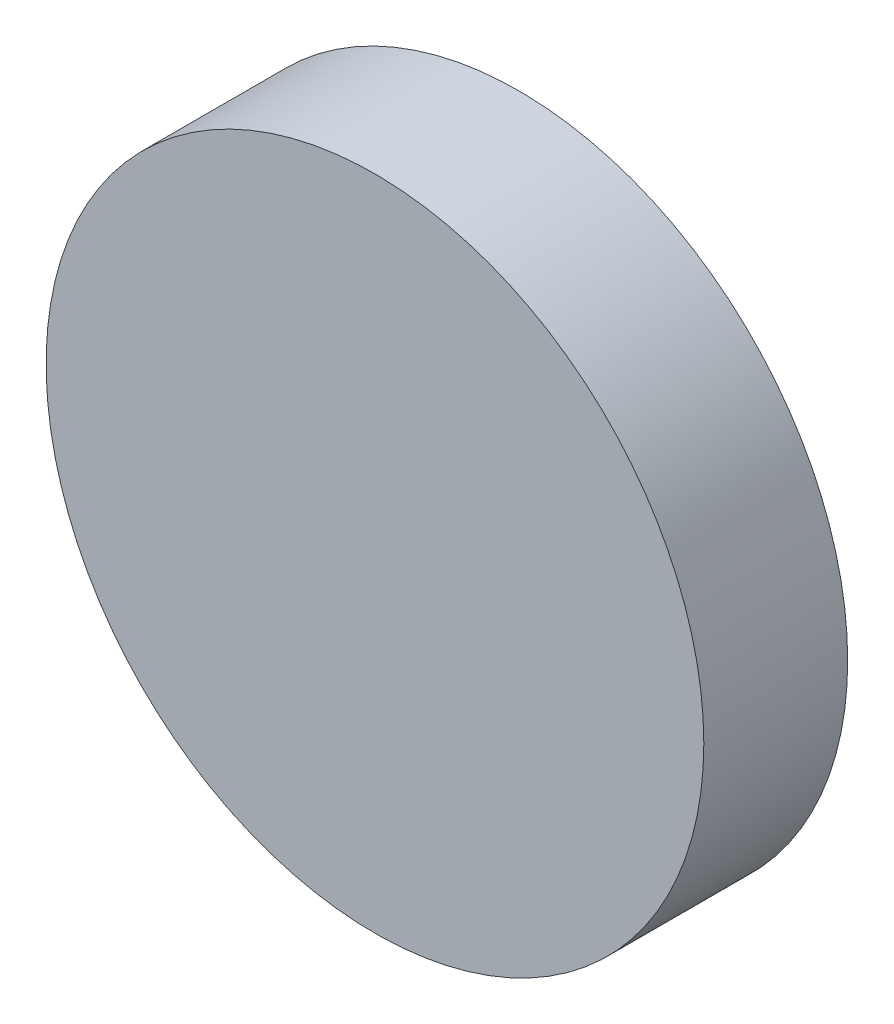
ISO-10303-21;
HEADER;
FILE_DESCRIPTION(('STEP AP214'),'2;1');
FILE_NAME('part.step','',(''),(''),'','','');
FILE_SCHEMA(('AUTOMOTIVE_DESIGN { 1 0 10303 214 1 1 1 1 }'));
ENDSEC;
DATA;
#1=APPLICATION_CONTEXT('core data for automotive mechanical design processes');
#2=APPLICATION_PROTOCOL_DEFINITION('international standard','automotive_design',2000,#1);
#3=PRODUCT_CONTEXT('',#1,'mechanical');
#4=PRODUCT('Part','Part','',(#3));
#5=PRODUCT_RELATED_PRODUCT_CATEGORY('part','',(#4));
#6=PRODUCT_DEFINITION_FORMATION('','',#4);
#7=PRODUCT_DEFINITION_CONTEXT('part definition',#1,'design');
#8=PRODUCT_DEFINITION('design','',#6,#7);
#9=PRODUCT_DEFINITION_SHAPE('','',#8);
#10=(LENGTH_UNIT() NAMED_UNIT(*) SI_UNIT(.MILLI.,.METRE.));
#11=(NAMED_UNIT(*) PLANE_ANGLE_UNIT() SI_UNIT($,.RADIAN.));
#12=(NAMED_UNIT(*) SI_UNIT($,.STERADIAN.) SOLID_ANGLE_UNIT());
#13=UNCERTAINTY_MEASURE_WITH_UNIT(LENGTH_MEASURE(1.E-05),#10,'distance_accuracy_value','');
#14=(GEOMETRIC_REPRESENTATION_CONTEXT(3) GLOBAL_UNCERTAINTY_ASSIGNED_CONTEXT((#13)) GLOBAL_UNIT_ASSIGNED_CONTEXT((#10,
#11,#12)) REPRESENTATION_CONTEXT('',''));
#15=CARTESIAN_POINT('',(0.,0.,0.));
#16=DIRECTION('',(0.,0.,1.));
#17=DIRECTION('',(1.,0.,0.));
#18=AXIS2_PLACEMENT_3D('',#15,#16,#17);
#19=CARTESIAN_POINT('',(16.,16.,7.));
#20=DIRECTION('',(0.,0.,-1.));
#21=DIRECTION('',(-1.,0.,0.));
#22=AXIS2_PLACEMENT_3D('',#19,#20,#21);
#23=CYLINDRICAL_SURFACE('',#22,16.);
#24=CARTESIAN_POINT('',(16.,16.,7.));
#25=DIRECTION('',(0.,0.,1.));
#26=DIRECTION('',(1.,0.,0.));
#27=AXIS2_PLACEMENT_3D('',#24,#25,#26);
#28=CIRCLE('',#27,16.);
#29=CARTESIAN_POINT('',(32.,16.,7.));
#30=VERTEX_POINT('',#29);
#31=EDGE_CURVE('E10',#30,#30,#28,.T.);
#32=ORIENTED_EDGE('',*,*,#31,.F.);
#33=EDGE_LOOP('',(#32));
#34=FACE_BOUND('',#33,.T.);
#35=CARTESIAN_POINT('',(16.,16.,0.));
#36=DIRECTION('',(0.,0.,1.));
#37=DIRECTION('',(1.,0.,0.));
#38=AXIS2_PLACEMENT_3D('',#35,#36,#37);
#39=CIRCLE('',#38,16.);
#40=CARTESIAN_POINT('',(32.,16.,0.));
#41=VERTEX_POINT('',#40);
#42=EDGE_CURVE('E42',#41,#41,#39,.T.);
#43=ORIENTED_EDGE('',*,*,#42,.T.);
#44=EDGE_LOOP('',(#43));
#45=FACE_BOUND('',#44,.T.);
#46=ADVANCED_FACE('F41',(#34,#45),#23,.T.);
#47=CARTESIAN_POINT('',(16.,16.,7.));
#48=DIRECTION('',(0.,0.,1.));
#49=DIRECTION('',(1.,0.,0.));
#50=AXIS2_PLACEMENT_3D('',#47,#48,#49);
#51=PLANE('',#50);
#52=ORIENTED_EDGE('',*,*,#31,.T.);
#53=EDGE_LOOP('',(#52));
#54=FACE_BOUND('',#53,.T.);
#55=ADVANCED_FACE('F57',(#54),#51,.T.);
#56=CARTESIAN_POINT('',(16.,16.,0.));
#57=DIRECTION('',(0.,0.,1.));
#58=DIRECTION('',(1.,0.,0.));
#59=AXIS2_PLACEMENT_3D('',#56,#57,#58);
#60=PLANE('',#59);
#61=ORIENTED_EDGE('',*,*,#42,.F.);
#62=EDGE_LOOP('',(#61));
#63=FACE_BOUND('',#62,.T.);
#64=ADVANCED_FACE('F53',(#63),#60,.F.);
#65=CLOSED_SHELL('',(#46,#55,#64));
#66=MANIFOLD_SOLID_BREP('B2',#65);
#67=ADVANCED_BREP_SHAPE_REPRESENTATION('',(#18,#66),#14);
#68=SHAPE_DEFINITION_REPRESENTATION(#9,#67);
ENDSEC;
END-ISO-10303-21;
